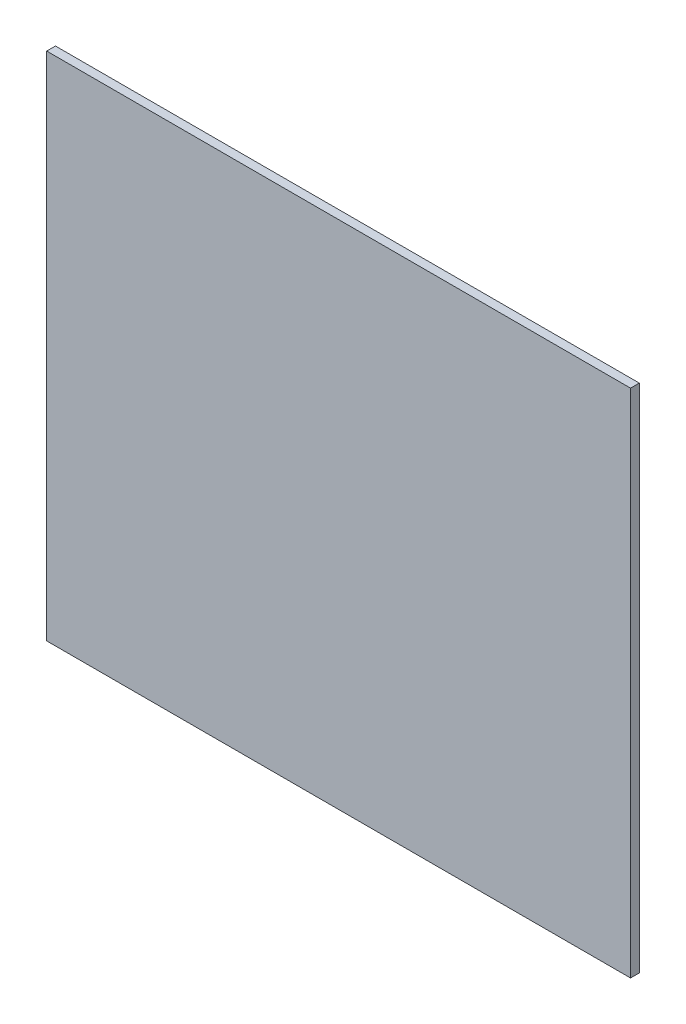
ISO-10303-21;
HEADER;
FILE_DESCRIPTION(('STEP AP214'),'2;1');
FILE_NAME('part.step','',(''),(''),'','','');
FILE_SCHEMA(('AUTOMOTIVE_DESIGN { 1 0 10303 214 1 1 1 1 }'));
ENDSEC;
DATA;
#1=APPLICATION_CONTEXT('core data for automotive mechanical design processes');
#2=APPLICATION_PROTOCOL_DEFINITION('international standard','automotive_design',2000,#1);
#3=PRODUCT_CONTEXT('',#1,'mechanical');
#4=PRODUCT('Part','Part','',(#3));
#5=PRODUCT_RELATED_PRODUCT_CATEGORY('part','',(#4));
#6=PRODUCT_DEFINITION_FORMATION('','',#4);
#7=PRODUCT_DEFINITION_CONTEXT('part definition',#1,'design');
#8=PRODUCT_DEFINITION('design','',#6,#7);
#9=PRODUCT_DEFINITION_SHAPE('','',#8);
#10=(LENGTH_UNIT() NAMED_UNIT(*) SI_UNIT(.MILLI.,.METRE.));
#11=(NAMED_UNIT(*) PLANE_ANGLE_UNIT() SI_UNIT($,.RADIAN.));
#12=(NAMED_UNIT(*) SI_UNIT($,.STERADIAN.) SOLID_ANGLE_UNIT());
#13=UNCERTAINTY_MEASURE_WITH_UNIT(LENGTH_MEASURE(1.E-05),#10,'distance_accuracy_value','');
#14=(GEOMETRIC_REPRESENTATION_CONTEXT(3) GLOBAL_UNCERTAINTY_ASSIGNED_CONTEXT((#13)) GLOBAL_UNIT_ASSIGNED_CONTEXT((#10,
#11,#12)) REPRESENTATION_CONTEXT('',''));
#15=CARTESIAN_POINT('',(0.,0.,0.));
#16=DIRECTION('',(0.,0.,1.));
#17=DIRECTION('',(1.,0.,0.));
#18=AXIS2_PLACEMENT_3D('',#15,#16,#17);
#19=CARTESIAN_POINT('',(100.,-87.5,3.));
#20=DIRECTION('',(-1.,0.,0.));
#21=DIRECTION('',(0.,0.,1.));
#22=AXIS2_PLACEMENT_3D('',#19,#20,#21);
#23=PLANE('',#22);
#24=DIRECTION('',(0.,1.,0.));
#25=VECTOR('',#24,1.);
#26=CARTESIAN_POINT('',(100.,-87.5,0.));
#27=LINE('',#26,#25);
#28=CARTESIAN_POINT('',(100.,-87.5,0.));
#29=VERTEX_POINT('',#28);
#30=CARTESIAN_POINT('',(100.,87.5,0.));
#31=VERTEX_POINT('',#30);
#32=EDGE_CURVE('E95',#29,#31,#27,.T.);
#33=ORIENTED_EDGE('',*,*,#32,.T.);
#34=DIRECTION('',(0.,0.,-1.));
#35=VECTOR('',#34,1.);
#36=CARTESIAN_POINT('',(100.,87.5,3.));
#37=LINE('',#36,#35);
#38=CARTESIAN_POINT('',(100.,87.5,3.));
#39=VERTEX_POINT('',#38);
#40=EDGE_CURVE('E11',#39,#31,#37,.T.);
#41=ORIENTED_EDGE('',*,*,#40,.F.);
#42=DIRECTION('',(0.,1.,0.));
#43=VECTOR('',#42,1.);
#44=CARTESIAN_POINT('',(100.,-87.5,3.));
#45=LINE('',#44,#43);
#46=CARTESIAN_POINT('',(100.,-87.5,3.));
#47=VERTEX_POINT('',#46);
#48=EDGE_CURVE('E83',#47,#39,#45,.T.);
#49=ORIENTED_EDGE('',*,*,#48,.F.);
#50=DIRECTION('',(0.,0.,-1.));
#51=VECTOR('',#50,1.);
#52=CARTESIAN_POINT('',(100.,-87.5,3.));
#53=LINE('',#52,#51);
#54=EDGE_CURVE('E91',#47,#29,#53,.T.);
#55=ORIENTED_EDGE('',*,*,#54,.T.);
#56=EDGE_LOOP('',(#33,#41,#49,#55));
#57=FACE_BOUND('',#56,.T.);
#58=ADVANCED_FACE('F32',(#57),#23,.F.);
#59=CARTESIAN_POINT('',(-100.,87.5,3.));
#60=DIRECTION('',(0.,-1.,0.));
#61=DIRECTION('',(0.,0.,-1.));
#62=AXIS2_PLACEMENT_3D('',#59,#60,#61);
#63=PLANE('',#62);
#64=DIRECTION('',(-1.,0.,0.));
#65=VECTOR('',#64,1.);
#66=CARTESIAN_POINT('',(-100.,87.5,0.));
#67=LINE('',#66,#65);
#68=CARTESIAN_POINT('',(-100.,87.5,0.));
#69=VERTEX_POINT('',#68);
#70=EDGE_CURVE('E87',#31,#69,#67,.T.);
#71=ORIENTED_EDGE('',*,*,#70,.T.);
#72=DIRECTION('',(0.,0.,-1.));
#73=VECTOR('',#72,1.);
#74=CARTESIAN_POINT('',(-100.,87.5,3.));
#75=LINE('',#74,#73);
#76=CARTESIAN_POINT('',(-100.,87.5,3.));
#77=VERTEX_POINT('',#76);
#78=EDGE_CURVE('E40',#77,#69,#75,.T.);
#79=ORIENTED_EDGE('',*,*,#78,.F.);
#80=DIRECTION('',(-1.,0.,0.));
#81=VECTOR('',#80,1.);
#82=CARTESIAN_POINT('',(-100.,87.5,3.));
#83=LINE('',#82,#81);
#84=EDGE_CURVE('E78',#39,#77,#83,.T.);
#85=ORIENTED_EDGE('',*,*,#84,.F.);
#86=ORIENTED_EDGE('',*,*,#40,.T.);
#87=EDGE_LOOP('',(#71,#79,#85,#86));
#88=FACE_BOUND('',#87,.T.);
#89=ADVANCED_FACE('F86',(#88),#63,.F.);
#90=CARTESIAN_POINT('',(-100.,-87.5,3.));
#91=DIRECTION('',(1.,0.,0.));
#92=DIRECTION('',(0.,0.,-1.));
#93=AXIS2_PLACEMENT_3D('',#90,#91,#92);
#94=PLANE('',#93);
#95=DIRECTION('',(0.,-1.,0.));
#96=VECTOR('',#95,1.);
#97=CARTESIAN_POINT('',(-100.,-87.5,0.));
#98=LINE('',#97,#96);
#99=CARTESIAN_POINT('',(-100.,-87.5,0.));
#100=VERTEX_POINT('',#99);
#101=EDGE_CURVE('E65',#69,#100,#98,.T.);
#102=ORIENTED_EDGE('',*,*,#101,.T.);
#103=DIRECTION('',(0.,0.,-1.));
#104=VECTOR('',#103,1.);
#105=CARTESIAN_POINT('',(-100.,-87.5,3.));
#106=LINE('',#105,#104);
#107=CARTESIAN_POINT('',(-100.,-87.5,3.));
#108=VERTEX_POINT('',#107);
#109=EDGE_CURVE('E88',#108,#100,#106,.T.);
#110=ORIENTED_EDGE('',*,*,#109,.F.);
#111=DIRECTION('',(0.,-1.,0.));
#112=VECTOR('',#111,1.);
#113=CARTESIAN_POINT('',(-100.,-87.5,3.));
#114=LINE('',#113,#112);
#115=EDGE_CURVE('E81',#77,#108,#114,.T.);
#116=ORIENTED_EDGE('',*,*,#115,.F.);
#117=ORIENTED_EDGE('',*,*,#78,.T.);
#118=EDGE_LOOP('',(#102,#110,#116,#117));
#119=FACE_BOUND('',#118,.T.);
#120=ADVANCED_FACE('F89',(#119),#94,.F.);
#121=CARTESIAN_POINT('',(-100.,-87.5,3.));
#122=DIRECTION('',(0.,1.,0.));
#123=DIRECTION('',(0.,0.,1.));
#124=AXIS2_PLACEMENT_3D('',#121,#122,#123);
#125=PLANE('',#124);
#126=DIRECTION('',(1.,0.,0.));
#127=VECTOR('',#126,1.);
#128=CARTESIAN_POINT('',(-100.,-87.5,0.));
#129=LINE('',#128,#127);
#130=EDGE_CURVE('E71',#100,#29,#129,.T.);
#131=ORIENTED_EDGE('',*,*,#130,.T.);
#132=ORIENTED_EDGE('',*,*,#54,.F.);
#133=DIRECTION('',(1.,0.,0.));
#134=VECTOR('',#133,1.);
#135=CARTESIAN_POINT('',(-100.,-87.5,3.));
#136=LINE('',#135,#134);
#137=EDGE_CURVE('E48',#108,#47,#136,.T.);
#138=ORIENTED_EDGE('',*,*,#137,.F.);
#139=ORIENTED_EDGE('',*,*,#109,.T.);
#140=EDGE_LOOP('',(#131,#132,#138,#139));
#141=FACE_BOUND('',#140,.T.);
#142=ADVANCED_FACE('F102',(#141),#125,.F.);
#143=CARTESIAN_POINT('',(0.,0.,3.));
#144=DIRECTION('',(0.,0.,-1.));
#145=DIRECTION('',(-1.,0.,0.));
#146=AXIS2_PLACEMENT_3D('',#143,#144,#145);
#147=PLANE('',#146);
#148=ORIENTED_EDGE('',*,*,#48,.T.);
#149=ORIENTED_EDGE('',*,*,#84,.T.);
#150=ORIENTED_EDGE('',*,*,#115,.T.);
#151=ORIENTED_EDGE('',*,*,#137,.T.);
#152=EDGE_LOOP('',(#148,#149,#150,#151));
#153=FACE_BOUND('',#152,.T.);
#154=ADVANCED_FACE('F79',(#153),#147,.F.);
#155=CARTESIAN_POINT('',(0.,0.,0.));
#156=DIRECTION('',(0.,0.,-1.));
#157=DIRECTION('',(-1.,0.,0.));
#158=AXIS2_PLACEMENT_3D('',#155,#156,#157);
#159=PLANE('',#158);
#160=ORIENTED_EDGE('',*,*,#32,.F.);
#161=ORIENTED_EDGE('',*,*,#130,.F.);
#162=ORIENTED_EDGE('',*,*,#101,.F.);
#163=ORIENTED_EDGE('',*,*,#70,.F.);
#164=EDGE_LOOP('',(#160,#161,#162,#163));
#165=FACE_BOUND('',#164,.T.);
#166=ADVANCED_FACE('F105',(#165),#159,.T.);
#167=CLOSED_SHELL('',(#58,#89,#120,#142,#154,#166));
#168=MANIFOLD_SOLID_BREP('B2',#167);
#169=ADVANCED_BREP_SHAPE_REPRESENTATION('',(#18,#168),#14);
#170=SHAPE_DEFINITION_REPRESENTATION(#9,#169);
ENDSEC;
END-ISO-10303-21;
